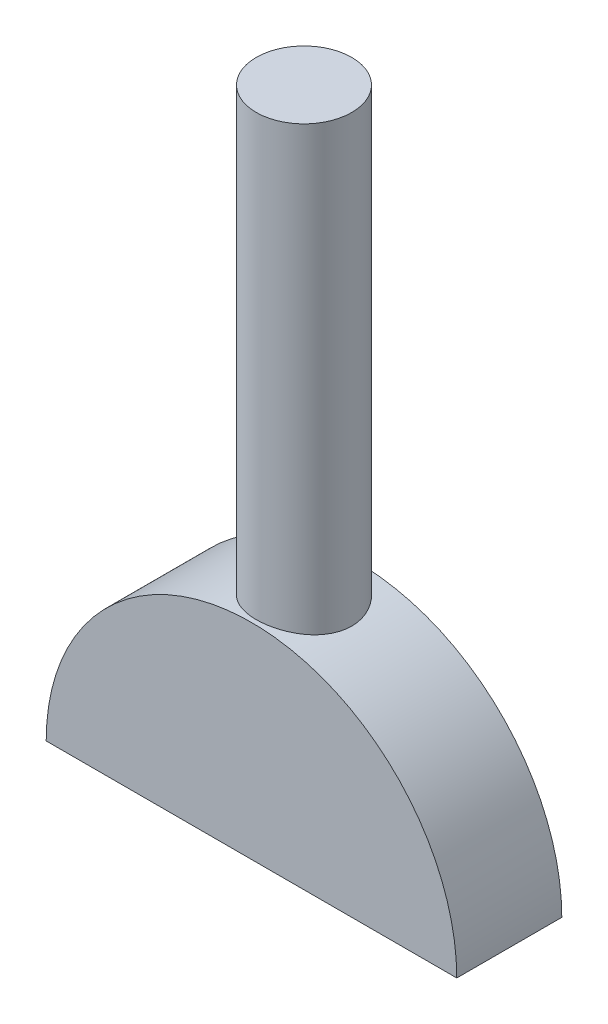
ISO-10303-21;
HEADER;
FILE_DESCRIPTION(('STEP AP214'),'2;1');
FILE_NAME('part.step','',(''),(''),'','','');
FILE_SCHEMA(('AUTOMOTIVE_DESIGN { 1 0 10303 214 1 1 1 1 }'));
ENDSEC;
DATA;
#1=APPLICATION_CONTEXT('core data for automotive mechanical design processes');
#2=APPLICATION_PROTOCOL_DEFINITION('international standard','automotive_design',2000,#1);
#3=PRODUCT_CONTEXT('',#1,'mechanical');
#4=PRODUCT('Part','Part','',(#3));
#5=PRODUCT_RELATED_PRODUCT_CATEGORY('part','',(#4));
#6=PRODUCT_DEFINITION_FORMATION('','',#4);
#7=PRODUCT_DEFINITION_CONTEXT('part definition',#1,'design');
#8=PRODUCT_DEFINITION('design','',#6,#7);
#9=PRODUCT_DEFINITION_SHAPE('','',#8);
#10=(LENGTH_UNIT() NAMED_UNIT(*) SI_UNIT(.MILLI.,.METRE.));
#11=(NAMED_UNIT(*) PLANE_ANGLE_UNIT() SI_UNIT($,.RADIAN.));
#12=(NAMED_UNIT(*) SI_UNIT($,.STERADIAN.) SOLID_ANGLE_UNIT());
#13=UNCERTAINTY_MEASURE_WITH_UNIT(LENGTH_MEASURE(1.E-05),#10,'distance_accuracy_value','');
#14=(GEOMETRIC_REPRESENTATION_CONTEXT(3) GLOBAL_UNCERTAINTY_ASSIGNED_CONTEXT((#13)) GLOBAL_UNIT_ASSIGNED_CONTEXT((#10,
#11,#12)) REPRESENTATION_CONTEXT('',''));
#15=CARTESIAN_POINT('',(0.,0.,0.));
#16=DIRECTION('',(0.,0.,1.));
#17=DIRECTION('',(1.,0.,0.));
#18=AXIS2_PLACEMENT_3D('',#15,#16,#17);
#19=CARTESIAN_POINT('',(0.,-7.55,2.75));
#20=DIRECTION('',(0.,0.,-1.));
#21=DIRECTION('',(-1.,0.,0.));
#22=AXIS2_PLACEMENT_3D('',#19,#20,#21);
#23=CYLINDRICAL_SURFACE('',#22,10.75);
#24=CARTESIAN_POINT('',(0.,-7.55,-2.75));
#25=DIRECTION('',(0.,0.,1.));
#26=DIRECTION('',(-1.,0.,0.));
#27=AXIS2_PLACEMENT_3D('',#24,#25,#26);
#28=CIRCLE('',#27,10.75);
#29=CARTESIAN_POINT('',(10.75,-7.55,-2.75));
#30=VERTEX_POINT('',#29);
#31=CARTESIAN_POINT('',(-10.75,-7.55,-2.75));
#32=VERTEX_POINT('',#31);
#33=EDGE_CURVE('E83',#30,#32,#28,.T.);
#34=ORIENTED_EDGE('',*,*,#33,.T.);
#35=DIRECTION('',(0.,0.,-1.));
#36=VECTOR('',#35,1.);
#37=CARTESIAN_POINT('',(-10.75,-7.55,2.75));
#38=LINE('',#37,#36);
#39=CARTESIAN_POINT('',(-10.75,-7.55,2.75));
#40=VERTEX_POINT('',#39);
#41=EDGE_CURVE('E71',#40,#32,#38,.T.);
#42=ORIENTED_EDGE('',*,*,#41,.F.);
#43=CARTESIAN_POINT('',(0.,-7.55,2.75));
#44=DIRECTION('',(0.,0.,1.));
#45=DIRECTION('',(-1.,0.,0.));
#46=AXIS2_PLACEMENT_3D('',#43,#44,#45);
#47=CIRCLE('',#46,10.75);
#48=CARTESIAN_POINT('',(10.75,-7.55,2.75));
#49=VERTEX_POINT('',#48);
#50=EDGE_CURVE('E74',#49,#40,#47,.T.);
#51=ORIENTED_EDGE('',*,*,#50,.F.);
#52=DIRECTION('',(0.,0.,-1.));
#53=VECTOR('',#52,1.);
#54=CARTESIAN_POINT('',(10.75,-7.55,2.75));
#55=LINE('',#54,#53);
#56=EDGE_CURVE('E54',#49,#30,#55,.T.);
#57=ORIENTED_EDGE('',*,*,#56,.T.);
#58=EDGE_LOOP('',(#34,#42,#51,#57));
#59=FACE_BOUND('',#58,.T.);
#60=CARTESIAN_POINT('',(0.,3.2,-2.5));
#61=CARTESIAN_POINT('',(-0.138430301575037,3.19999750319151,-2.49999560506181));
#62=CARTESIAN_POINT('',(-0.276911913473482,3.19729915202348,-2.4884634610203));
#63=CARTESIAN_POINT('',(-0.549926458784533,3.1867958570245,-2.44269647693178));
#64=CARTESIAN_POINT('',(-0.684456760552424,3.1789875870207,-2.40844684931464));
#65=CARTESIAN_POINT('',(-0.945584938183639,3.15913182821228,-2.31838761860548));
#66=CARTESIAN_POINT('',(-1.0721914537649,3.14708905482873,-2.26260199064556));
#67=CARTESIAN_POINT('',(-1.31424605467158,3.12005666047749,-2.13113400715375));
#68=CARTESIAN_POINT('',(-1.42969413955334,3.10506703939265,-2.05545165083078));
#69=CARTESIAN_POINT('',(-1.64823535864029,3.07347505478296,-1.88489793991748));
#70=CARTESIAN_POINT('',(-1.75109891780349,3.05685055993102,-1.789736494368));
#71=CARTESIAN_POINT('',(-1.93955848850037,3.02401457632465,-1.58354794513688));
#72=CARTESIAN_POINT('',(-2.02515279422305,3.00780312850795,-1.47251927598168));
#73=CARTESIAN_POINT('',(-2.17768545016578,2.97740856542855,-1.23601422017863));
#74=CARTESIAN_POINT('',(-2.24437410971773,2.96325370227909,-1.11037283932835));
#75=CARTESIAN_POINT('',(-2.35559908073292,2.93889491811176,-0.849281887678193));
#76=CARTESIAN_POINT('',(-2.4001384160733,2.9286904578179,-0.713833658626063));
#77=CARTESIAN_POINT('',(-2.46503121812638,2.91361420014048,-0.439479235067546));
#78=CARTESIAN_POINT('',(-2.48579391128058,2.90865229116996,-0.300674896125934));
#79=CARTESIAN_POINT('',(-2.50381748256829,2.90435270898474,-0.0214712506987686));
#80=CARTESIAN_POINT('',(-2.50108164292363,2.9050142502991,0.118927830300988));
#81=CARTESIAN_POINT('',(-2.47251392197624,2.91180548311933,0.394253759072592));
#82=CARTESIAN_POINT('',(-2.44716256910422,2.91782140019227,0.529233703458667));
#83=CARTESIAN_POINT('',(-2.37484699133983,2.93446305364852,0.792970440932314));
#84=CARTESIAN_POINT('',(-2.32788141315426,2.94508907867398,0.921726843798429));
#85=CARTESIAN_POINT('',(-2.21324302270599,2.96986247506174,1.170685728806));
#86=CARTESIAN_POINT('',(-2.14538989864088,2.98404030071047,1.29080202547054));
#87=CARTESIAN_POINT('',(-1.99102899336895,3.01430178467923,1.51811925353874));
#88=CARTESIAN_POINT('',(-1.90451835804818,3.0303857344169,1.62531820500945));
#89=CARTESIAN_POINT('',(-1.71277772345754,3.06313151914933,1.82651902329277));
#90=CARTESIAN_POINT('',(-1.60714039778179,3.07979784876279,1.92013241224978));
#91=CARTESIAN_POINT('',(-1.38147212434,3.11147255006379,2.08838292296156));
#92=CARTESIAN_POINT('',(-1.26144084561019,3.12648088361336,2.16301960825704));
#93=CARTESIAN_POINT('',(-1.00988367171819,3.15320772357192,2.29131368113398));
#94=CARTESIAN_POINT('',(-0.878328172850241,3.16491741092063,2.34491497721171));
#95=CARTESIAN_POINT('',(-0.607743088756511,3.18366278024297,2.42913908699762));
#96=CARTESIAN_POINT('',(-0.468714739856912,3.19069923281071,2.45976568923102));
#97=CARTESIAN_POINT('',(-0.190458024371457,3.19919376582593,2.49659398371813));
#98=CARTESIAN_POINT('',(-0.0513033936918172,3.20077285834813,2.50332561844543));
#99=CARTESIAN_POINT('',(0.226142618990254,3.19851622863861,2.49361657110735));
#100=CARTESIAN_POINT('',(0.364434066805161,3.19468092441485,2.47717767787762));
#101=CARTESIAN_POINT('',(0.634435674116296,3.1821033264015,2.42203268240167));
#102=CARTESIAN_POINT('',(0.766206741068598,3.17342337007586,2.38360930580585));
#103=CARTESIAN_POINT('',(1.02143078918067,3.15213034660271,2.28590373747149));
#104=CARTESIAN_POINT('',(1.14488300012157,3.13951691587296,2.22661961744995));
#105=CARTESIAN_POINT('',(1.38212116458415,3.11146090594889,2.0878044024766));
#106=CARTESIAN_POINT('',(1.49572353836429,3.09597676888751,2.00796815860749));
#107=CARTESIAN_POINT('',(1.70810813669894,3.06397296312819,1.8307116404194));
#108=CARTESIAN_POINT('',(1.80688816319638,3.04745314135897,1.73328876282757));
#109=CARTESIAN_POINT('',(1.98895769542002,3.01481419241602,1.52117931951149));
#110=CARTESIAN_POINT('',(2.07187803775181,2.99871078181823,1.406172978343));
#111=CARTESIAN_POINT('',(2.21723369419156,2.96912063394067,1.16355863239348));
#112=CARTESIAN_POINT('',(2.2796699213677,2.95563378004028,1.03595118962959));
#113=CARTESIAN_POINT('',(2.38183981806495,2.93294232280679,0.772453548399414));
#114=CARTESIAN_POINT('',(2.42170591457558,2.92371280067,0.636616952365524));
#115=CARTESIAN_POINT('',(2.47797776744044,2.91054381109424,0.359926985037168));
#116=CARTESIAN_POINT('',(2.49438784866433,2.90660336845179,0.219074543484896));
#117=CARTESIAN_POINT('',(2.50307946388958,2.90452574224374,-0.0599127150005768));
#118=CARTESIAN_POINT('',(2.49594818281383,2.90624732841495,-0.19802850207683));
#119=CARTESIAN_POINT('',(2.45908550618846,2.91497732981205,-0.471031391272357));
#120=CARTESIAN_POINT('',(2.42935445239757,2.92198566509053,-0.605918542183959));
#121=CARTESIAN_POINT('',(2.34843618580645,2.94042633364151,-0.868095348207958));
#122=CARTESIAN_POINT('',(2.29734500000521,2.95183884994469,-0.995416128804655));
#123=CARTESIAN_POINT('',(2.17523564108103,2.97780742441041,-1.23976225565119));
#124=CARTESIAN_POINT('',(2.10421508795806,2.9923638579772,-1.35678637006122));
#125=CARTESIAN_POINT('',(1.94236117695633,3.02339383884857,-1.58008783968238));
#126=CARTESIAN_POINT('',(1.85111397778857,3.03990345584638,-1.68606027687766));
#127=CARTESIAN_POINT('',(1.65222213721137,3.07274927916466,-1.88138083217006));
#128=CARTESIAN_POINT('',(1.54457367573377,3.08908544413523,-1.97072506654372));
#129=CARTESIAN_POINT('',(1.31397544476734,3.12003700364318,-2.13155495468457));
#130=CARTESIAN_POINT('',(1.1908192912888,3.13462271193669,-2.20275077861291));
#131=CARTESIAN_POINT('',(0.93396714660116,3.16012623954271,-2.32331623760121));
#132=CARTESIAN_POINT('',(0.800279552927019,3.17104694541565,-2.37270305918751));
#133=CARTESIAN_POINT('',(0.555506262920335,3.18618220358521,-2.4400668023848));
#134=CARTESIAN_POINT('',(0.44568195564944,3.19133032052494,-2.46249651007911));
#135=CARTESIAN_POINT('',(0.223916210244377,3.19824013345637,-2.49246446821424));
#136=CARTESIAN_POINT('',(0.1119748913737,3.20000201964351,-2.50000355502171));
#137=CARTESIAN_POINT('',(0.,3.2,-2.5));
#138=B_SPLINE_CURVE_WITH_KNOTS('',3,(#60,#61,#62,#63,#64,#65,#66,#67,#68,#69,#70,#71,#72,#73,
#74,#75,#76,#77,#78,#79,#80,#81,#82,#83,#84,#85,#86,#87,#88,#89,#90,#91,#92,#93,#94,#95,#96,#97,
#98,#99,#100,#101,#102,#103,#104,#105,#106,#107,#108,#109,#110,#111,#112,#113,#114,#115,#116,
#117,#118,#119,#120,#121,#122,#123,#124,#125,#126,#127,#128,#129,#130,#131,#132,#133,#134,#135,
#136,#137),.UNSPECIFIED.,.T.,.F.,(4,2,2,2,2,2,2,2,2,2,2,2,2,2,2,2,2,2,2,2,2,2,2,2,2,2,2,2,2,2,2,
2,2,2,2,2,2,2,4),(0.,0.41488083420789,0.830031993607981,1.24472230911864,1.65941264111703,
2.08079844626528,2.5022258544284,2.92898423462477,3.3556843367711,3.7749244677384,
4.19410604114645,4.60458765327946,5.01509496966788,5.42925037981496,5.84346918996281,
6.26785438711292,6.6922493441304,7.11776839638568,7.54321726514858,7.95916944874712,
8.37508952132331,8.78577727169088,9.19650299435459,9.61371922070162,10.030997256469,
10.4570445145426,10.8830727792127,11.3065747663732,11.7299986572653,12.1429417975303,
12.5558786933028,12.9669788118543,13.3781280456119,13.7986273925422,14.2192248294072,
14.6461690703739,15.0727762560217,15.4083880791491,15.7439810513155),.UNSPECIFIED.);
#139=CARTESIAN_POINT('',(0.,3.2,-2.5));
#140=VERTEX_POINT('',#139);
#141=EDGE_CURVE('E11',#140,#140,#138,.T.);
#142=ORIENTED_EDGE('',*,*,#141,.F.);
#143=EDGE_LOOP('',(#142));
#144=FACE_BOUND('',#143,.T.);
#145=ADVANCED_FACE('F41',(#59,#144),#23,.T.);
#146=CARTESIAN_POINT('',(0.,-7.55,2.75));
#147=DIRECTION('',(0.,1.,0.));
#148=DIRECTION('',(0.,0.,1.));
#149=AXIS2_PLACEMENT_3D('',#146,#147,#148);
#150=PLANE('',#149);
#151=DIRECTION('',(1.,0.,0.));
#152=VECTOR('',#151,1.);
#153=CARTESIAN_POINT('',(0.,-7.55,-2.75));
#154=LINE('',#153,#152);
#155=EDGE_CURVE('E78',#32,#30,#154,.T.);
#156=ORIENTED_EDGE('',*,*,#155,.T.);
#157=ORIENTED_EDGE('',*,*,#56,.F.);
#158=DIRECTION('',(1.,0.,0.));
#159=VECTOR('',#158,1.);
#160=CARTESIAN_POINT('',(0.,-7.55,2.75));
#161=LINE('',#160,#159);
#162=EDGE_CURVE('E59',#40,#49,#161,.T.);
#163=ORIENTED_EDGE('',*,*,#162,.F.);
#164=ORIENTED_EDGE('',*,*,#41,.T.);
#165=EDGE_LOOP('',(#156,#157,#163,#164));
#166=FACE_BOUND('',#165,.T.);
#167=ADVANCED_FACE('F69',(#166),#150,.F.);
#168=CARTESIAN_POINT('',(0.,-7.55,2.75));
#169=DIRECTION('',(0.,0.,-1.));
#170=DIRECTION('',(-1.,0.,0.));
#171=AXIS2_PLACEMENT_3D('',#168,#169,#170);
#172=PLANE('',#171);
#173=ORIENTED_EDGE('',*,*,#50,.T.);
#174=ORIENTED_EDGE('',*,*,#162,.T.);
#175=EDGE_LOOP('',(#173,#174));
#176=FACE_BOUND('',#175,.T.);
#177=ADVANCED_FACE('F76',(#176),#172,.F.);
#178=CARTESIAN_POINT('',(0.,-7.55,-2.75));
#179=DIRECTION('',(0.,0.,-1.));
#180=DIRECTION('',(-1.,0.,0.));
#181=AXIS2_PLACEMENT_3D('',#178,#179,#180);
#182=PLANE('',#181);
#183=ORIENTED_EDGE('',*,*,#33,.F.);
#184=ORIENTED_EDGE('',*,*,#155,.F.);
#185=EDGE_LOOP('',(#183,#184));
#186=FACE_BOUND('',#185,.T.);
#187=ADVANCED_FACE('F91',(#186),#182,.T.);
#188=CARTESIAN_POINT('',(0.,26.2,0.));
#189=DIRECTION('',(0.,-1.,0.));
#190=DIRECTION('',(0.,0.,-1.));
#191=AXIS2_PLACEMENT_3D('',#188,#189,#190);
#192=CYLINDRICAL_SURFACE('',#191,2.5);
#193=CARTESIAN_POINT('',(0.,26.2,0.));
#194=DIRECTION('',(0.,1.,0.));
#195=DIRECTION('',(0.,0.,1.));
#196=AXIS2_PLACEMENT_3D('',#193,#194,#195);
#197=CIRCLE('',#196,2.5);
#198=CARTESIAN_POINT('',(0.,26.2,2.5));
#199=VERTEX_POINT('',#198);
#200=EDGE_CURVE('E84',#199,#199,#197,.T.);
#201=ORIENTED_EDGE('',*,*,#200,.F.);
#202=EDGE_LOOP('',(#201));
#203=FACE_BOUND('',#202,.T.);
#204=ORIENTED_EDGE('',*,*,#141,.T.);
#205=EDGE_LOOP('',(#204));
#206=FACE_BOUND('',#205,.T.);
#207=ADVANCED_FACE('F93',(#203,#206),#192,.T.);
#208=CARTESIAN_POINT('',(0.,26.2,0.));
#209=DIRECTION('',(0.,1.,0.));
#210=DIRECTION('',(0.,0.,1.));
#211=AXIS2_PLACEMENT_3D('',#208,#209,#210);
#212=PLANE('',#211);
#213=ORIENTED_EDGE('',*,*,#200,.T.);
#214=EDGE_LOOP('',(#213));
#215=FACE_BOUND('',#214,.T.);
#216=ADVANCED_FACE('F99',(#215),#212,.T.);
#217=CLOSED_SHELL('',(#145,#167,#177,#187,#207,#216));
#218=MANIFOLD_SOLID_BREP('B2',#217);
#219=ADVANCED_BREP_SHAPE_REPRESENTATION('',(#18,#218),#14);
#220=SHAPE_DEFINITION_REPRESENTATION(#9,#219);
ENDSEC;
END-ISO-10303-21;
